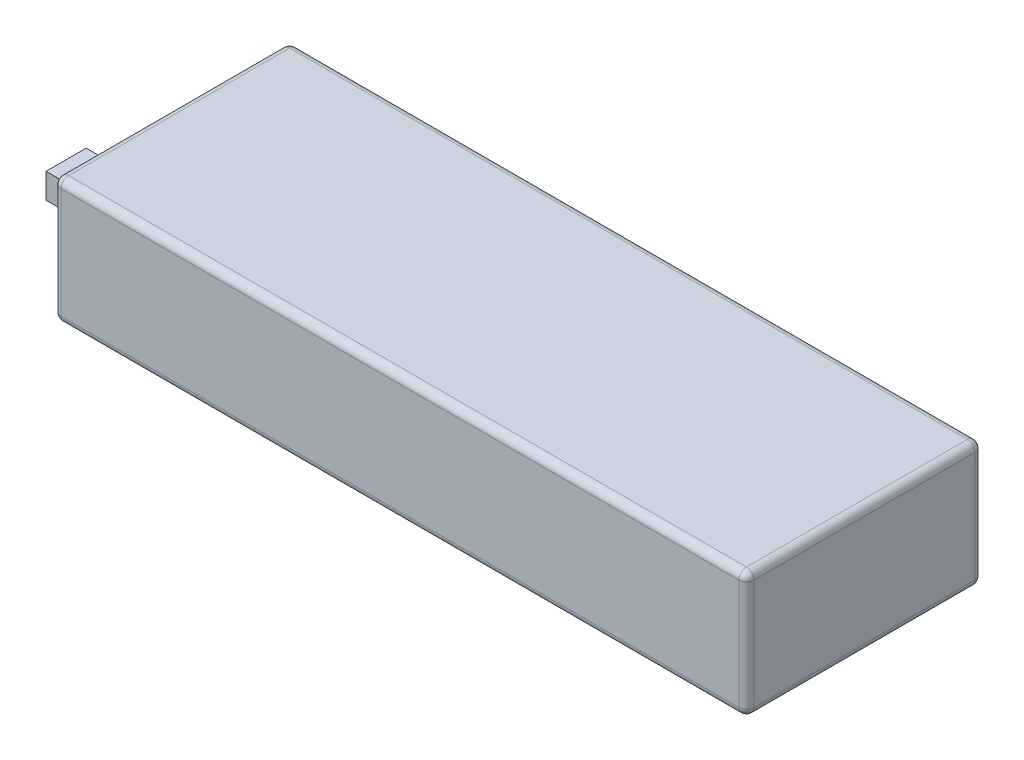
ISO-10303-21;
HEADER;
FILE_DESCRIPTION(('STEP AP214'),'2;1');
FILE_NAME('part.step','',(''),(''),'','','');
FILE_SCHEMA(('AUTOMOTIVE_DESIGN { 1 0 10303 214 1 1 1 1 }'));
ENDSEC;
DATA;
#1=APPLICATION_CONTEXT('core data for automotive mechanical design processes');
#2=APPLICATION_PROTOCOL_DEFINITION('international standard','automotive_design',2000,#1);
#3=PRODUCT_CONTEXT('',#1,'mechanical');
#4=PRODUCT('Part','Part','',(#3));
#5=PRODUCT_RELATED_PRODUCT_CATEGORY('part','',(#4));
#6=PRODUCT_DEFINITION_FORMATION('','',#4);
#7=PRODUCT_DEFINITION_CONTEXT('part definition',#1,'design');
#8=PRODUCT_DEFINITION('design','',#6,#7);
#9=PRODUCT_DEFINITION_SHAPE('','',#8);
#10=(LENGTH_UNIT() NAMED_UNIT(*) SI_UNIT(.MILLI.,.METRE.));
#11=(NAMED_UNIT(*) PLANE_ANGLE_UNIT() SI_UNIT($,.RADIAN.));
#12=(NAMED_UNIT(*) SI_UNIT($,.STERADIAN.) SOLID_ANGLE_UNIT());
#13=UNCERTAINTY_MEASURE_WITH_UNIT(LENGTH_MEASURE(1.E-05),#10,'distance_accuracy_value','');
#14=(GEOMETRIC_REPRESENTATION_CONTEXT(3) GLOBAL_UNCERTAINTY_ASSIGNED_CONTEXT((#13)) GLOBAL_UNIT_ASSIGNED_CONTEXT((#10,
#11,#12)) REPRESENTATION_CONTEXT('',''));
#15=CARTESIAN_POINT('',(0.,0.,0.));
#16=DIRECTION('',(0.,0.,1.));
#17=DIRECTION('',(1.,0.,0.));
#18=AXIS2_PLACEMENT_3D('',#15,#16,#17);
#19=CARTESIAN_POINT('',(-69.,12.5,23.5));
#20=DIRECTION('',(1.,0.,0.));
#21=DIRECTION('',(0.,0.,-1.));
#22=AXIS2_PLACEMENT_3D('',#19,#20,#21);
#23=PLANE('',#22);
#24=DIRECTION('',(0.,-1.,0.));
#25=VECTOR('',#24,1.);
#26=CARTESIAN_POINT('',(-69.,12.5,-22.));
#27=LINE('',#26,#25);
#28=CARTESIAN_POINT('',(-69.,11.,-22.));
#29=VERTEX_POINT('',#28);
#30=CARTESIAN_POINT('',(-69.,-11.,-22.));
#31=VERTEX_POINT('',#30);
#32=EDGE_CURVE('E201',#29,#31,#27,.T.);
#33=ORIENTED_EDGE('',*,*,#32,.T.);
#34=DIRECTION('',(0.,0.,1.));
#35=VECTOR('',#34,1.);
#36=CARTESIAN_POINT('',(-69.,-11.,23.5));
#37=LINE('',#36,#35);
#38=CARTESIAN_POINT('',(-69.,-11.,22.));
#39=VERTEX_POINT('',#38);
#40=EDGE_CURVE('E204',#31,#39,#37,.T.);
#41=ORIENTED_EDGE('',*,*,#40,.T.);
#42=DIRECTION('',(0.,-1.,0.));
#43=VECTOR('',#42,1.);
#44=CARTESIAN_POINT('',(-69.,12.5,22.));
#45=LINE('',#44,#43);
#46=CARTESIAN_POINT('',(-69.,11.,22.));
#47=VERTEX_POINT('',#46);
#48=EDGE_CURVE('E198',#39,#47,#45,.F.);
#49=ORIENTED_EDGE('',*,*,#48,.T.);
#50=DIRECTION('',(0.,0.,1.));
#51=VECTOR('',#50,1.);
#52=CARTESIAN_POINT('',(-69.,11.,23.5));
#53=LINE('',#52,#51);
#54=EDGE_CURVE('E195',#47,#29,#53,.F.);
#55=ORIENTED_EDGE('',*,*,#54,.T.);
#56=EDGE_LOOP('',(#33,#41,#49,#55));
#57=FACE_BOUND('',#56,.T.);
#58=DIRECTION('',(0.,-1.,0.));
#59=VECTOR('',#58,1.);
#60=CARTESIAN_POINT('',(-69.,4.,12.));
#61=LINE('',#60,#59);
#62=CARTESIAN_POINT('',(-69.,9.,12.));
#63=VERTEX_POINT('',#62);
#64=CARTESIAN_POINT('',(-69.,4.,12.));
#65=VERTEX_POINT('',#64);
#66=EDGE_CURVE('E183',#63,#65,#61,.T.);
#67=ORIENTED_EDGE('',*,*,#66,.F.);
#68=DIRECTION('',(0.,0.,-1.));
#69=VECTOR('',#68,1.);
#70=CARTESIAN_POINT('',(-69.,9.,20.));
#71=LINE('',#70,#69);
#72=CARTESIAN_POINT('',(-69.,9.,20.));
#73=VERTEX_POINT('',#72);
#74=EDGE_CURVE('E180',#73,#63,#71,.T.);
#75=ORIENTED_EDGE('',*,*,#74,.F.);
#76=DIRECTION('',(0.,1.,0.));
#77=VECTOR('',#76,1.);
#78=CARTESIAN_POINT('',(-69.,4.,20.));
#79=LINE('',#78,#77);
#80=CARTESIAN_POINT('',(-69.,4.,20.));
#81=VERTEX_POINT('',#80);
#82=EDGE_CURVE('E68',#81,#73,#79,.T.);
#83=ORIENTED_EDGE('',*,*,#82,.F.);
#84=DIRECTION('',(0.,0.,1.));
#85=VECTOR('',#84,1.);
#86=CARTESIAN_POINT('',(-69.,4.,20.));
#87=LINE('',#86,#85);
#88=EDGE_CURVE('E63',#65,#81,#87,.T.);
#89=ORIENTED_EDGE('',*,*,#88,.F.);
#90=EDGE_LOOP('',(#67,#75,#83,#89));
#91=FACE_BOUND('',#90,.T.);
#92=ADVANCED_FACE('F45',(#57,#91),#23,.F.);
#93=CARTESIAN_POINT('',(69.,12.5,23.5));
#94=DIRECTION('',(-1.,0.,0.));
#95=DIRECTION('',(0.,0.,1.));
#96=AXIS2_PLACEMENT_3D('',#93,#94,#95);
#97=PLANE('',#96);
#98=DIRECTION('',(0.,0.,-1.));
#99=VECTOR('',#98,1.);
#100=CARTESIAN_POINT('',(69.,-11.,-23.5));
#101=LINE('',#100,#99);
#102=CARTESIAN_POINT('',(69.,-11.,22.));
#103=VERTEX_POINT('',#102);
#104=CARTESIAN_POINT('',(69.,-11.,-22.));
#105=VERTEX_POINT('',#104);
#106=EDGE_CURVE('E240',#103,#105,#101,.T.);
#107=ORIENTED_EDGE('',*,*,#106,.T.);
#108=DIRECTION('',(0.,-1.,0.));
#109=VECTOR('',#108,1.);
#110=CARTESIAN_POINT('',(69.,12.5,-22.));
#111=LINE('',#110,#109);
#112=CARTESIAN_POINT('',(69.,11.,-22.));
#113=VERTEX_POINT('',#112);
#114=EDGE_CURVE('E243',#105,#113,#111,.F.);
#115=ORIENTED_EDGE('',*,*,#114,.T.);
#116=DIRECTION('',(0.,0.,-1.));
#117=VECTOR('',#116,1.);
#118=CARTESIAN_POINT('',(69.,11.,23.5));
#119=LINE('',#118,#117);
#120=CARTESIAN_POINT('',(69.,11.,22.));
#121=VERTEX_POINT('',#120);
#122=EDGE_CURVE('E234',#113,#121,#119,.F.);
#123=ORIENTED_EDGE('',*,*,#122,.T.);
#124=DIRECTION('',(0.,-1.,0.));
#125=VECTOR('',#124,1.);
#126=CARTESIAN_POINT('',(69.,12.5,22.));
#127=LINE('',#126,#125);
#128=EDGE_CURVE('E237',#121,#103,#127,.T.);
#129=ORIENTED_EDGE('',*,*,#128,.T.);
#130=EDGE_LOOP('',(#107,#115,#123,#129));
#131=FACE_BOUND('',#130,.T.);
#132=ADVANCED_FACE('F366',(#131),#97,.F.);
#133=CARTESIAN_POINT('',(-69.,12.5,-23.5));
#134=DIRECTION('',(0.,0.,1.));
#135=DIRECTION('',(1.,0.,0.));
#136=AXIS2_PLACEMENT_3D('',#133,#134,#135);
#137=PLANE('',#136);
#138=DIRECTION('',(-1.,0.,0.));
#139=VECTOR('',#138,1.);
#140=CARTESIAN_POINT('',(-69.,-11.,-23.5));
#141=LINE('',#140,#139);
#142=CARTESIAN_POINT('',(67.5,-11.,-23.5));
#143=VERTEX_POINT('',#142);
#144=CARTESIAN_POINT('',(-67.5,-11.,-23.5));
#145=VERTEX_POINT('',#144);
#146=EDGE_CURVE('E227',#143,#145,#141,.T.);
#147=ORIENTED_EDGE('',*,*,#146,.T.);
#148=DIRECTION('',(0.,-1.,0.));
#149=VECTOR('',#148,1.);
#150=CARTESIAN_POINT('',(-67.5,12.5,-23.5));
#151=LINE('',#150,#149);
#152=CARTESIAN_POINT('',(-67.5,11.,-23.5));
#153=VERTEX_POINT('',#152);
#154=EDGE_CURVE('E230',#145,#153,#151,.F.);
#155=ORIENTED_EDGE('',*,*,#154,.T.);
#156=DIRECTION('',(-1.,0.,0.));
#157=VECTOR('',#156,1.);
#158=CARTESIAN_POINT('',(-69.,11.,-23.5));
#159=LINE('',#158,#157);
#160=CARTESIAN_POINT('',(67.5,11.,-23.5));
#161=VERTEX_POINT('',#160);
#162=EDGE_CURVE('E221',#153,#161,#159,.F.);
#163=ORIENTED_EDGE('',*,*,#162,.T.);
#164=DIRECTION('',(0.,-1.,0.));
#165=VECTOR('',#164,1.);
#166=CARTESIAN_POINT('',(67.5,12.5,-23.5));
#167=LINE('',#166,#165);
#168=EDGE_CURVE('E224',#161,#143,#167,.T.);
#169=ORIENTED_EDGE('',*,*,#168,.T.);
#170=EDGE_LOOP('',(#147,#155,#163,#169));
#171=FACE_BOUND('',#170,.T.);
#172=ADVANCED_FACE('F387',(#171),#137,.F.);
#173=CARTESIAN_POINT('',(-69.,12.5,23.5));
#174=DIRECTION('',(0.,0.,-1.));
#175=DIRECTION('',(-1.,0.,0.));
#176=AXIS2_PLACEMENT_3D('',#173,#174,#175);
#177=PLANE('',#176);
#178=DIRECTION('',(0.,-1.,0.));
#179=VECTOR('',#178,1.);
#180=CARTESIAN_POINT('',(-67.5,12.5,23.5));
#181=LINE('',#180,#179);
#182=CARTESIAN_POINT('',(-67.5,11.,23.5));
#183=VERTEX_POINT('',#182);
#184=CARTESIAN_POINT('',(-67.5,-11.,23.5));
#185=VERTEX_POINT('',#184);
#186=EDGE_CURVE('E253',#183,#185,#181,.T.);
#187=ORIENTED_EDGE('',*,*,#186,.T.);
#188=DIRECTION('',(1.,0.,0.));
#189=VECTOR('',#188,1.);
#190=CARTESIAN_POINT('',(69.,-11.,23.5));
#191=LINE('',#190,#189);
#192=CARTESIAN_POINT('',(67.5,-11.,23.5));
#193=VERTEX_POINT('',#192);
#194=EDGE_CURVE('E257',#185,#193,#191,.T.);
#195=ORIENTED_EDGE('',*,*,#194,.T.);
#196=DIRECTION('',(0.,-1.,0.));
#197=VECTOR('',#196,1.);
#198=CARTESIAN_POINT('',(67.5,12.5,23.5));
#199=LINE('',#198,#197);
#200=CARTESIAN_POINT('',(67.5,11.,23.5));
#201=VERTEX_POINT('',#200);
#202=EDGE_CURVE('E250',#193,#201,#199,.F.);
#203=ORIENTED_EDGE('',*,*,#202,.T.);
#204=DIRECTION('',(1.,0.,0.));
#205=VECTOR('',#204,1.);
#206=CARTESIAN_POINT('',(-69.,11.,23.5));
#207=LINE('',#206,#205);
#208=EDGE_CURVE('E247',#201,#183,#207,.F.);
#209=ORIENTED_EDGE('',*,*,#208,.T.);
#210=EDGE_LOOP('',(#187,#195,#203,#209));
#211=FACE_BOUND('',#210,.T.);
#212=ADVANCED_FACE('F483',(#211),#177,.F.);
#213=CARTESIAN_POINT('',(0.,12.5,0.));
#214=DIRECTION('',(0.,-1.,0.));
#215=DIRECTION('',(0.,0.,-1.));
#216=AXIS2_PLACEMENT_3D('',#213,#214,#215);
#217=PLANE('',#216);
#218=DIRECTION('',(0.,0.,1.));
#219=VECTOR('',#218,1.);
#220=CARTESIAN_POINT('',(-67.5,12.5,0.));
#221=LINE('',#220,#219);
#222=CARTESIAN_POINT('',(-67.5,12.5,-22.));
#223=VERTEX_POINT('',#222);
#224=CARTESIAN_POINT('',(-67.5,12.5,22.));
#225=VERTEX_POINT('',#224);
#226=EDGE_CURVE('E55',#223,#225,#221,.T.);
#227=ORIENTED_EDGE('',*,*,#226,.T.);
#228=DIRECTION('',(1.,0.,0.));
#229=VECTOR('',#228,1.);
#230=CARTESIAN_POINT('',(0.,12.5,22.));
#231=LINE('',#230,#229);
#232=CARTESIAN_POINT('',(67.5,12.5,22.));
#233=VERTEX_POINT('',#232);
#234=EDGE_CURVE('E11',#225,#233,#231,.T.);
#235=ORIENTED_EDGE('',*,*,#234,.T.);
#236=DIRECTION('',(0.,0.,-1.));
#237=VECTOR('',#236,1.);
#238=CARTESIAN_POINT('',(67.5,12.5,0.));
#239=LINE('',#238,#237);
#240=CARTESIAN_POINT('',(67.5,12.5,-22.));
#241=VERTEX_POINT('',#240);
#242=EDGE_CURVE('E260',#233,#241,#239,.T.);
#243=ORIENTED_EDGE('',*,*,#242,.T.);
#244=DIRECTION('',(-1.,0.,0.));
#245=VECTOR('',#244,1.);
#246=CARTESIAN_POINT('',(0.,12.5,-22.));
#247=LINE('',#246,#245);
#248=EDGE_CURVE('E263',#241,#223,#247,.T.);
#249=ORIENTED_EDGE('',*,*,#248,.T.);
#250=EDGE_LOOP('',(#227,#235,#243,#249));
#251=FACE_BOUND('',#250,.T.);
#252=ADVANCED_FACE('F403',(#251),#217,.F.);
#253=CARTESIAN_POINT('',(0.,-12.5,0.));
#254=DIRECTION('',(0.,-1.,0.));
#255=DIRECTION('',(0.,0.,-1.));
#256=AXIS2_PLACEMENT_3D('',#253,#254,#255);
#257=PLANE('',#256);
#258=DIRECTION('',(1.,0.,0.));
#259=VECTOR('',#258,1.);
#260=CARTESIAN_POINT('',(-69.,-12.5,22.));
#261=LINE('',#260,#259);
#262=CARTESIAN_POINT('',(67.5,-12.5,22.));
#263=VERTEX_POINT('',#262);
#264=CARTESIAN_POINT('',(-67.5,-12.5,22.));
#265=VERTEX_POINT('',#264);
#266=EDGE_CURVE('E208',#263,#265,#261,.F.);
#267=ORIENTED_EDGE('',*,*,#266,.T.);
#268=DIRECTION('',(0.,0.,1.));
#269=VECTOR('',#268,1.);
#270=CARTESIAN_POINT('',(-67.5,-12.5,-23.5));
#271=LINE('',#270,#269);
#272=CARTESIAN_POINT('',(-67.5,-12.5,-22.));
#273=VERTEX_POINT('',#272);
#274=EDGE_CURVE('E217',#265,#273,#271,.F.);
#275=ORIENTED_EDGE('',*,*,#274,.T.);
#276=DIRECTION('',(-1.,0.,0.));
#277=VECTOR('',#276,1.);
#278=CARTESIAN_POINT('',(69.,-12.5,-22.));
#279=LINE('',#278,#277);
#280=CARTESIAN_POINT('',(67.5,-12.5,-22.));
#281=VERTEX_POINT('',#280);
#282=EDGE_CURVE('E214',#273,#281,#279,.F.);
#283=ORIENTED_EDGE('',*,*,#282,.T.);
#284=DIRECTION('',(0.,0.,-1.));
#285=VECTOR('',#284,1.);
#286=CARTESIAN_POINT('',(67.5,-12.5,23.5));
#287=LINE('',#286,#285);
#288=EDGE_CURVE('E211',#281,#263,#287,.F.);
#289=ORIENTED_EDGE('',*,*,#288,.T.);
#290=EDGE_LOOP('',(#267,#275,#283,#289));
#291=FACE_BOUND('',#290,.T.);
#292=ADVANCED_FACE('F432',(#291),#257,.T.);
#293=CARTESIAN_POINT('',(67.5,11.,0.));
#294=DIRECTION('',(0.,0.,-1.));
#295=DIRECTION('',(-1.,0.,0.));
#296=AXIS2_PLACEMENT_3D('',#293,#294,#295);
#297=CYLINDRICAL_SURFACE('',#296,1.5);
#298=CARTESIAN_POINT('',(67.5,11.,-22.));
#299=DIRECTION('',(0.,0.,-1.));
#300=DIRECTION('',(-1.,0.,0.));
#301=AXIS2_PLACEMENT_3D('',#298,#299,#300);
#302=CIRCLE('',#301,1.5);
#303=EDGE_CURVE('E49',#241,#113,#302,.T.);
#304=ORIENTED_EDGE('',*,*,#303,.F.);
#305=ORIENTED_EDGE('',*,*,#242,.F.);
#306=CARTESIAN_POINT('',(67.5,11.,22.));
#307=DIRECTION('',(0.,0.,1.));
#308=DIRECTION('',(1.,0.,0.));
#309=AXIS2_PLACEMENT_3D('',#306,#307,#308);
#310=CIRCLE('',#309,1.5);
#311=EDGE_CURVE('E345',#121,#233,#310,.T.);
#312=ORIENTED_EDGE('',*,*,#311,.F.);
#313=ORIENTED_EDGE('',*,*,#122,.F.);
#314=EDGE_LOOP('',(#304,#305,#312,#313));
#315=FACE_BOUND('',#314,.T.);
#316=ADVANCED_FACE('F47',(#315),#297,.T.);
#317=CARTESIAN_POINT('',(67.5,11.,-22.));
#318=DIRECTION('',(1.,0.,0.));
#319=DIRECTION('',(0.,0.,-1.));
#320=AXIS2_PLACEMENT_3D('',#317,#318,#319);
#321=SPHERICAL_SURFACE('',#320,1.5);
#322=CARTESIAN_POINT('',(67.5,11.,-22.));
#323=DIRECTION('',(1.,0.,0.));
#324=DIRECTION('',(0.,0.,-1.));
#325=AXIS2_PLACEMENT_3D('',#322,#323,#324);
#326=CIRCLE('',#325,1.5);
#327=EDGE_CURVE('E339',#241,#161,#326,.F.);
#328=ORIENTED_EDGE('',*,*,#327,.F.);
#329=ORIENTED_EDGE('',*,*,#303,.T.);
#330=CARTESIAN_POINT('',(67.5,11.,-22.));
#331=DIRECTION('',(0.,1.,0.));
#332=DIRECTION('',(0.,0.,1.));
#333=AXIS2_PLACEMENT_3D('',#330,#331,#332);
#334=CIRCLE('',#333,1.5);
#335=EDGE_CURVE('E343',#161,#113,#334,.F.);
#336=ORIENTED_EDGE('',*,*,#335,.F.);
#337=EDGE_LOOP('',(#328,#329,#336));
#338=FACE_BOUND('',#337,.T.);
#339=ADVANCED_FACE('F360',(#338),#321,.T.);
#340=CARTESIAN_POINT('',(67.5,11.,22.));
#341=DIRECTION('',(0.,1.,0.));
#342=DIRECTION('',(0.,0.,1.));
#343=AXIS2_PLACEMENT_3D('',#340,#341,#342);
#344=SPHERICAL_SURFACE('',#343,1.5);
#345=CARTESIAN_POINT('',(67.5,11.,22.));
#346=DIRECTION('',(0.,1.,0.));
#347=DIRECTION('',(0.,0.,1.));
#348=AXIS2_PLACEMENT_3D('',#345,#346,#347);
#349=CIRCLE('',#348,1.5);
#350=EDGE_CURVE('E332',#121,#201,#349,.F.);
#351=ORIENTED_EDGE('',*,*,#350,.F.);
#352=ORIENTED_EDGE('',*,*,#311,.T.);
#353=CARTESIAN_POINT('',(67.5,11.,22.));
#354=DIRECTION('',(1.,0.,0.));
#355=DIRECTION('',(0.,0.,-1.));
#356=AXIS2_PLACEMENT_3D('',#353,#354,#355);
#357=CIRCLE('',#356,1.5);
#358=EDGE_CURVE('E336',#201,#233,#357,.F.);
#359=ORIENTED_EDGE('',*,*,#358,.F.);
#360=EDGE_LOOP('',(#351,#352,#359));
#361=FACE_BOUND('',#360,.T.);
#362=ADVANCED_FACE('F417',(#361),#344,.T.);
#363=CARTESIAN_POINT('',(67.5,12.5,-22.));
#364=DIRECTION('',(0.,-1.,0.));
#365=DIRECTION('',(0.,0.,-1.));
#366=AXIS2_PLACEMENT_3D('',#363,#364,#365);
#367=CYLINDRICAL_SURFACE('',#366,1.5);
#368=ORIENTED_EDGE('',*,*,#335,.T.);
#369=ORIENTED_EDGE('',*,*,#114,.F.);
#370=CARTESIAN_POINT('',(67.5,-11.,-22.));
#371=DIRECTION('',(0.,-1.,0.));
#372=DIRECTION('',(0.,0.,-1.));
#373=AXIS2_PLACEMENT_3D('',#370,#371,#372);
#374=CIRCLE('',#373,1.5);
#375=EDGE_CURVE('E324',#143,#105,#374,.T.);
#376=ORIENTED_EDGE('',*,*,#375,.F.);
#377=ORIENTED_EDGE('',*,*,#168,.F.);
#378=EDGE_LOOP('',(#368,#369,#376,#377));
#379=FACE_BOUND('',#378,.T.);
#380=ADVANCED_FACE('F371',(#379),#367,.T.);
#381=CARTESIAN_POINT('',(0.,11.,-22.));
#382=DIRECTION('',(-1.,0.,0.));
#383=DIRECTION('',(0.,0.,1.));
#384=AXIS2_PLACEMENT_3D('',#381,#382,#383);
#385=CYLINDRICAL_SURFACE('',#384,1.5);
#386=ORIENTED_EDGE('',*,*,#327,.T.);
#387=ORIENTED_EDGE('',*,*,#162,.F.);
#388=CARTESIAN_POINT('',(-67.5,11.,-22.));
#389=DIRECTION('',(-1.,0.,0.));
#390=DIRECTION('',(0.,0.,1.));
#391=AXIS2_PLACEMENT_3D('',#388,#389,#390);
#392=CIRCLE('',#391,1.5);
#393=EDGE_CURVE('E320',#223,#153,#392,.T.);
#394=ORIENTED_EDGE('',*,*,#393,.F.);
#395=ORIENTED_EDGE('',*,*,#248,.F.);
#396=EDGE_LOOP('',(#386,#387,#394,#395));
#397=FACE_BOUND('',#396,.T.);
#398=ADVANCED_FACE('F400',(#397),#385,.T.);
#399=CARTESIAN_POINT('',(-67.5,11.,0.));
#400=DIRECTION('',(0.,0.,1.));
#401=DIRECTION('',(1.,0.,0.));
#402=AXIS2_PLACEMENT_3D('',#399,#400,#401);
#403=CYLINDRICAL_SURFACE('',#402,1.5);
#404=CARTESIAN_POINT('',(-67.5,11.,22.));
#405=DIRECTION('',(0.,0.,1.));
#406=DIRECTION('',(1.,0.,0.));
#407=AXIS2_PLACEMENT_3D('',#404,#405,#406);
#408=CIRCLE('',#407,1.5);
#409=EDGE_CURVE('E312',#225,#47,#408,.T.);
#410=ORIENTED_EDGE('',*,*,#409,.F.);
#411=ORIENTED_EDGE('',*,*,#226,.F.);
#412=CARTESIAN_POINT('',(-67.5,11.,-22.));
#413=DIRECTION('',(0.,0.,-1.));
#414=DIRECTION('',(-1.,0.,0.));
#415=AXIS2_PLACEMENT_3D('',#412,#413,#414);
#416=CIRCLE('',#415,1.5);
#417=EDGE_CURVE('E316',#29,#223,#416,.T.);
#418=ORIENTED_EDGE('',*,*,#417,.F.);
#419=ORIENTED_EDGE('',*,*,#54,.F.);
#420=EDGE_LOOP('',(#410,#411,#418,#419));
#421=FACE_BOUND('',#420,.T.);
#422=ADVANCED_FACE('F407',(#421),#403,.T.);
#423=CARTESIAN_POINT('',(0.,11.,22.));
#424=DIRECTION('',(1.,0.,0.));
#425=DIRECTION('',(0.,0.,-1.));
#426=AXIS2_PLACEMENT_3D('',#423,#424,#425);
#427=CYLINDRICAL_SURFACE('',#426,1.5);
#428=ORIENTED_EDGE('',*,*,#358,.T.);
#429=ORIENTED_EDGE('',*,*,#234,.F.);
#430=CARTESIAN_POINT('',(-67.5,11.,22.));
#431=DIRECTION('',(-1.,0.,0.));
#432=DIRECTION('',(0.,0.,1.));
#433=AXIS2_PLACEMENT_3D('',#430,#431,#432);
#434=CIRCLE('',#433,1.5);
#435=EDGE_CURVE('E308',#183,#225,#434,.T.);
#436=ORIENTED_EDGE('',*,*,#435,.F.);
#437=ORIENTED_EDGE('',*,*,#208,.F.);
#438=EDGE_LOOP('',(#428,#429,#436,#437));
#439=FACE_BOUND('',#438,.T.);
#440=ADVANCED_FACE('F416',(#439),#427,.T.);
#441=CARTESIAN_POINT('',(67.5,12.5,22.));
#442=DIRECTION('',(0.,-1.,0.));
#443=DIRECTION('',(0.,0.,-1.));
#444=AXIS2_PLACEMENT_3D('',#441,#442,#443);
#445=CYLINDRICAL_SURFACE('',#444,1.5);
#446=ORIENTED_EDGE('',*,*,#350,.T.);
#447=ORIENTED_EDGE('',*,*,#202,.F.);
#448=CARTESIAN_POINT('',(67.5,-11.,22.));
#449=DIRECTION('',(0.,-1.,0.));
#450=DIRECTION('',(0.,0.,-1.));
#451=AXIS2_PLACEMENT_3D('',#448,#449,#450);
#452=CIRCLE('',#451,1.5);
#453=EDGE_CURVE('E304',#103,#193,#452,.T.);
#454=ORIENTED_EDGE('',*,*,#453,.F.);
#455=ORIENTED_EDGE('',*,*,#128,.F.);
#456=EDGE_LOOP('',(#446,#447,#454,#455));
#457=FACE_BOUND('',#456,.T.);
#458=ADVANCED_FACE('F421',(#457),#445,.T.);
#459=CARTESIAN_POINT('',(67.5,-11.,23.5));
#460=DIRECTION('',(0.,0.,1.));
#461=DIRECTION('',(1.,0.,0.));
#462=AXIS2_PLACEMENT_3D('',#459,#460,#461);
#463=CYLINDRICAL_SURFACE('',#462,1.5);
#464=CARTESIAN_POINT('',(67.5,-11.,-22.));
#465=DIRECTION('',(0.,0.,-1.));
#466=DIRECTION('',(-1.,0.,0.));
#467=AXIS2_PLACEMENT_3D('',#464,#465,#466);
#468=CIRCLE('',#467,1.5);
#469=EDGE_CURVE('E328',#105,#281,#468,.T.);
#470=ORIENTED_EDGE('',*,*,#469,.F.);
#471=ORIENTED_EDGE('',*,*,#106,.F.);
#472=CARTESIAN_POINT('',(67.5,-11.,22.));
#473=DIRECTION('',(0.,0.,1.));
#474=DIRECTION('',(1.,0.,0.));
#475=AXIS2_PLACEMENT_3D('',#472,#473,#474);
#476=CIRCLE('',#475,1.5);
#477=EDGE_CURVE('E300',#263,#103,#476,.T.);
#478=ORIENTED_EDGE('',*,*,#477,.F.);
#479=ORIENTED_EDGE('',*,*,#288,.F.);
#480=EDGE_LOOP('',(#470,#471,#478,#479));
#481=FACE_BOUND('',#480,.T.);
#482=ADVANCED_FACE('F375',(#481),#463,.T.);
#483=CARTESIAN_POINT('',(67.5,-11.,-22.));
#484=DIRECTION('',(1.,0.,0.));
#485=DIRECTION('',(0.,1.,0.));
#486=AXIS2_PLACEMENT_3D('',#483,#484,#485);
#487=SPHERICAL_SURFACE('',#486,1.5);
#488=ORIENTED_EDGE('',*,*,#375,.T.);
#489=ORIENTED_EDGE('',*,*,#469,.T.);
#490=CARTESIAN_POINT('',(67.5,-11.,-22.));
#491=DIRECTION('',(1.,0.,0.));
#492=DIRECTION('',(0.,0.,-1.));
#493=AXIS2_PLACEMENT_3D('',#490,#491,#492);
#494=CIRCLE('',#493,1.5);
#495=EDGE_CURVE('E296',#143,#281,#494,.F.);
#496=ORIENTED_EDGE('',*,*,#495,.F.);
#497=EDGE_LOOP('',(#488,#489,#496));
#498=FACE_BOUND('',#497,.T.);
#499=ADVANCED_FACE('F379',(#498),#487,.T.);
#500=CARTESIAN_POINT('',(-67.5,11.,-22.));
#501=DIRECTION('',(0.,1.,0.));
#502=DIRECTION('',(0.,0.,1.));
#503=AXIS2_PLACEMENT_3D('',#500,#501,#502);
#504=SPHERICAL_SURFACE('',#503,1.5);
#505=ORIENTED_EDGE('',*,*,#417,.T.);
#506=ORIENTED_EDGE('',*,*,#393,.T.);
#507=CARTESIAN_POINT('',(-67.5,11.,-22.));
#508=DIRECTION('',(0.,1.,0.));
#509=DIRECTION('',(0.,0.,1.));
#510=AXIS2_PLACEMENT_3D('',#507,#508,#509);
#511=CIRCLE('',#510,1.5);
#512=EDGE_CURVE('E293',#29,#153,#511,.F.);
#513=ORIENTED_EDGE('',*,*,#512,.F.);
#514=EDGE_LOOP('',(#505,#506,#513));
#515=FACE_BOUND('',#514,.T.);
#516=ADVANCED_FACE('F397',(#515),#504,.T.);
#517=CARTESIAN_POINT('',(-67.5,11.,22.));
#518=DIRECTION('',(0.,1.,0.));
#519=DIRECTION('',(0.,0.,1.));
#520=AXIS2_PLACEMENT_3D('',#517,#518,#519);
#521=SPHERICAL_SURFACE('',#520,1.5);
#522=ORIENTED_EDGE('',*,*,#435,.T.);
#523=ORIENTED_EDGE('',*,*,#409,.T.);
#524=CARTESIAN_POINT('',(-67.5,11.,22.));
#525=DIRECTION('',(0.,1.,0.));
#526=DIRECTION('',(0.,0.,1.));
#527=AXIS2_PLACEMENT_3D('',#524,#525,#526);
#528=CIRCLE('',#527,1.5);
#529=EDGE_CURVE('E289',#183,#47,#528,.F.);
#530=ORIENTED_EDGE('',*,*,#529,.F.);
#531=EDGE_LOOP('',(#522,#523,#530));
#532=FACE_BOUND('',#531,.T.);
#533=ADVANCED_FACE('F412',(#532),#521,.T.);
#534=CARTESIAN_POINT('',(67.5,-11.,22.));
#535=DIRECTION('',(1.,0.,0.));
#536=DIRECTION('',(0.,1.,0.));
#537=AXIS2_PLACEMENT_3D('',#534,#535,#536);
#538=SPHERICAL_SURFACE('',#537,1.5);
#539=ORIENTED_EDGE('',*,*,#477,.T.);
#540=ORIENTED_EDGE('',*,*,#453,.T.);
#541=CARTESIAN_POINT('',(67.5,-11.,22.));
#542=DIRECTION('',(1.,0.,0.));
#543=DIRECTION('',(0.,0.,-1.));
#544=AXIS2_PLACEMENT_3D('',#541,#542,#543);
#545=CIRCLE('',#544,1.5);
#546=EDGE_CURVE('E285',#263,#193,#545,.F.);
#547=ORIENTED_EDGE('',*,*,#546,.F.);
#548=EDGE_LOOP('',(#539,#540,#547));
#549=FACE_BOUND('',#548,.T.);
#550=ADVANCED_FACE('F424',(#549),#538,.T.);
#551=CARTESIAN_POINT('',(-69.,-11.,-22.));
#552=DIRECTION('',(1.,0.,0.));
#553=DIRECTION('',(0.,0.,-1.));
#554=AXIS2_PLACEMENT_3D('',#551,#552,#553);
#555=CYLINDRICAL_SURFACE('',#554,1.5);
#556=ORIENTED_EDGE('',*,*,#495,.T.);
#557=ORIENTED_EDGE('',*,*,#282,.F.);
#558=CARTESIAN_POINT('',(-67.5,-11.,-22.));
#559=DIRECTION('',(-1.,0.,0.));
#560=DIRECTION('',(0.,0.,1.));
#561=AXIS2_PLACEMENT_3D('',#558,#559,#560);
#562=CIRCLE('',#561,1.5);
#563=EDGE_CURVE('E281',#145,#273,#562,.T.);
#564=ORIENTED_EDGE('',*,*,#563,.F.);
#565=ORIENTED_EDGE('',*,*,#146,.F.);
#566=EDGE_LOOP('',(#556,#557,#564,#565));
#567=FACE_BOUND('',#566,.T.);
#568=ADVANCED_FACE('F384',(#567),#555,.T.);
#569=CARTESIAN_POINT('',(-67.5,12.5,-22.));
#570=DIRECTION('',(0.,-1.,0.));
#571=DIRECTION('',(0.,0.,-1.));
#572=AXIS2_PLACEMENT_3D('',#569,#570,#571);
#573=CYLINDRICAL_SURFACE('',#572,1.5);
#574=ORIENTED_EDGE('',*,*,#512,.T.);
#575=ORIENTED_EDGE('',*,*,#154,.F.);
#576=CARTESIAN_POINT('',(-67.5,-11.,-22.));
#577=DIRECTION('',(0.,-1.,0.));
#578=DIRECTION('',(0.,0.,-1.));
#579=AXIS2_PLACEMENT_3D('',#576,#577,#578);
#580=CIRCLE('',#579,1.5);
#581=EDGE_CURVE('E277',#31,#145,#580,.T.);
#582=ORIENTED_EDGE('',*,*,#581,.F.);
#583=ORIENTED_EDGE('',*,*,#32,.F.);
#584=EDGE_LOOP('',(#574,#575,#582,#583));
#585=FACE_BOUND('',#584,.T.);
#586=ADVANCED_FACE('F390',(#585),#573,.T.);
#587=CARTESIAN_POINT('',(-67.5,12.5,22.));
#588=DIRECTION('',(0.,-1.,0.));
#589=DIRECTION('',(0.,0.,-1.));
#590=AXIS2_PLACEMENT_3D('',#587,#588,#589);
#591=CYLINDRICAL_SURFACE('',#590,1.5);
#592=ORIENTED_EDGE('',*,*,#529,.T.);
#593=ORIENTED_EDGE('',*,*,#48,.F.);
#594=CARTESIAN_POINT('',(-67.5,-11.,22.));
#595=DIRECTION('',(0.,-1.,0.));
#596=DIRECTION('',(0.,0.,-1.));
#597=AXIS2_PLACEMENT_3D('',#594,#595,#596);
#598=CIRCLE('',#597,1.5);
#599=EDGE_CURVE('E273',#185,#39,#598,.T.);
#600=ORIENTED_EDGE('',*,*,#599,.F.);
#601=ORIENTED_EDGE('',*,*,#186,.F.);
#602=EDGE_LOOP('',(#592,#593,#600,#601));
#603=FACE_BOUND('',#602,.T.);
#604=ADVANCED_FACE('F442',(#603),#591,.T.);
#605=CARTESIAN_POINT('',(-69.,-11.,22.));
#606=DIRECTION('',(-1.,0.,0.));
#607=DIRECTION('',(0.,0.,1.));
#608=AXIS2_PLACEMENT_3D('',#605,#606,#607);
#609=CYLINDRICAL_SURFACE('',#608,1.5);
#610=ORIENTED_EDGE('',*,*,#546,.T.);
#611=ORIENTED_EDGE('',*,*,#194,.F.);
#612=CARTESIAN_POINT('',(-67.5,-11.,22.));
#613=DIRECTION('',(-1.,0.,0.));
#614=DIRECTION('',(0.,0.,1.));
#615=AXIS2_PLACEMENT_3D('',#612,#613,#614);
#616=CIRCLE('',#615,1.5);
#617=EDGE_CURVE('E270',#265,#185,#616,.T.);
#618=ORIENTED_EDGE('',*,*,#617,.F.);
#619=ORIENTED_EDGE('',*,*,#266,.F.);
#620=EDGE_LOOP('',(#610,#611,#618,#619));
#621=FACE_BOUND('',#620,.T.);
#622=ADVANCED_FACE('F429',(#621),#609,.T.);
#623=CARTESIAN_POINT('',(-67.5,-11.,-22.));
#624=DIRECTION('',(0.,0.,-1.));
#625=DIRECTION('',(0.,1.,0.));
#626=AXIS2_PLACEMENT_3D('',#623,#624,#625);
#627=SPHERICAL_SURFACE('',#626,1.5);
#628=ORIENTED_EDGE('',*,*,#581,.T.);
#629=ORIENTED_EDGE('',*,*,#563,.T.);
#630=CARTESIAN_POINT('',(-67.5,-11.,-22.));
#631=DIRECTION('',(0.,0.,-1.));
#632=DIRECTION('',(-1.,0.,0.));
#633=AXIS2_PLACEMENT_3D('',#630,#631,#632);
#634=CIRCLE('',#633,1.5);
#635=EDGE_CURVE('E189',#31,#273,#634,.F.);
#636=ORIENTED_EDGE('',*,*,#635,.F.);
#637=EDGE_LOOP('',(#628,#629,#636));
#638=FACE_BOUND('',#637,.T.);
#639=ADVANCED_FACE('F497',(#638),#627,.T.);
#640=CARTESIAN_POINT('',(-67.5,-11.,22.));
#641=DIRECTION('',(0.,0.,1.));
#642=DIRECTION('',(0.,-1.,0.));
#643=AXIS2_PLACEMENT_3D('',#640,#641,#642);
#644=SPHERICAL_SURFACE('',#643,1.5);
#645=ORIENTED_EDGE('',*,*,#617,.T.);
#646=ORIENTED_EDGE('',*,*,#599,.T.);
#647=CARTESIAN_POINT('',(-67.5,-11.,22.));
#648=DIRECTION('',(0.,0.,1.));
#649=DIRECTION('',(1.,0.,0.));
#650=AXIS2_PLACEMENT_3D('',#647,#648,#649);
#651=CIRCLE('',#650,1.5);
#652=EDGE_CURVE('E185',#265,#39,#651,.F.);
#653=ORIENTED_EDGE('',*,*,#652,.F.);
#654=EDGE_LOOP('',(#645,#646,#653));
#655=FACE_BOUND('',#654,.T.);
#656=ADVANCED_FACE('F438',(#655),#644,.T.);
#657=CARTESIAN_POINT('',(-67.5,-11.,23.5));
#658=DIRECTION('',(0.,0.,-1.));
#659=DIRECTION('',(-1.,0.,0.));
#660=AXIS2_PLACEMENT_3D('',#657,#658,#659);
#661=CYLINDRICAL_SURFACE('',#660,1.5);
#662=ORIENTED_EDGE('',*,*,#635,.T.);
#663=ORIENTED_EDGE('',*,*,#274,.F.);
#664=ORIENTED_EDGE('',*,*,#652,.T.);
#665=ORIENTED_EDGE('',*,*,#40,.F.);
#666=EDGE_LOOP('',(#662,#663,#664,#665));
#667=FACE_BOUND('',#666,.T.);
#668=ADVANCED_FACE('F435',(#667),#661,.T.);
#669=CARTESIAN_POINT('',(-74.,4.,12.));
#670=DIRECTION('',(0.,0.,1.));
#671=DIRECTION('',(1.,0.,0.));
#672=AXIS2_PLACEMENT_3D('',#669,#670,#671);
#673=PLANE('',#672);
#674=ORIENTED_EDGE('',*,*,#66,.T.);
#675=DIRECTION('',(1.,0.,0.));
#676=VECTOR('',#675,1.);
#677=CARTESIAN_POINT('',(-74.,4.,12.));
#678=LINE('',#677,#676);
#679=CARTESIAN_POINT('',(-74.,4.,12.));
#680=VERTEX_POINT('',#679);
#681=EDGE_CURVE('E162',#680,#65,#678,.T.);
#682=ORIENTED_EDGE('',*,*,#681,.F.);
#683=DIRECTION('',(0.,-1.,0.));
#684=VECTOR('',#683,1.);
#685=CARTESIAN_POINT('',(-74.,4.,12.));
#686=LINE('',#685,#684);
#687=CARTESIAN_POINT('',(-74.,9.,12.));
#688=VERTEX_POINT('',#687);
#689=EDGE_CURVE('E170',#688,#680,#686,.T.);
#690=ORIENTED_EDGE('',*,*,#689,.F.);
#691=DIRECTION('',(1.,0.,0.));
#692=VECTOR('',#691,1.);
#693=CARTESIAN_POINT('',(-74.,9.,12.));
#694=LINE('',#693,#692);
#695=EDGE_CURVE('E452',#688,#63,#694,.T.);
#696=ORIENTED_EDGE('',*,*,#695,.T.);
#697=EDGE_LOOP('',(#674,#682,#690,#696));
#698=FACE_BOUND('',#697,.T.);
#699=ADVANCED_FACE('F182',(#698),#673,.F.);
#700=CARTESIAN_POINT('',(-74.,4.,20.));
#701=DIRECTION('',(0.,1.,0.));
#702=DIRECTION('',(0.,0.,1.));
#703=AXIS2_PLACEMENT_3D('',#700,#701,#702);
#704=PLANE('',#703);
#705=ORIENTED_EDGE('',*,*,#88,.T.);
#706=DIRECTION('',(1.,0.,0.));
#707=VECTOR('',#706,1.);
#708=CARTESIAN_POINT('',(-74.,4.,20.));
#709=LINE('',#708,#707);
#710=CARTESIAN_POINT('',(-74.,4.,20.));
#711=VERTEX_POINT('',#710);
#712=EDGE_CURVE('E165',#711,#81,#709,.T.);
#713=ORIENTED_EDGE('',*,*,#712,.F.);
#714=DIRECTION('',(0.,0.,1.));
#715=VECTOR('',#714,1.);
#716=CARTESIAN_POINT('',(-74.,4.,20.));
#717=LINE('',#716,#715);
#718=EDGE_CURVE('E158',#680,#711,#717,.T.);
#719=ORIENTED_EDGE('',*,*,#718,.F.);
#720=ORIENTED_EDGE('',*,*,#681,.T.);
#721=EDGE_LOOP('',(#705,#713,#719,#720));
#722=FACE_BOUND('',#721,.T.);
#723=ADVANCED_FACE('F160',(#722),#704,.F.);
#724=CARTESIAN_POINT('',(-74.,4.,20.));
#725=DIRECTION('',(0.,0.,-1.));
#726=DIRECTION('',(-1.,0.,0.));
#727=AXIS2_PLACEMENT_3D('',#724,#725,#726);
#728=PLANE('',#727);
#729=ORIENTED_EDGE('',*,*,#82,.T.);
#730=DIRECTION('',(1.,0.,0.));
#731=VECTOR('',#730,1.);
#732=CARTESIAN_POINT('',(-74.,9.,20.));
#733=LINE('',#732,#731);
#734=CARTESIAN_POINT('',(-74.,9.,20.));
#735=VERTEX_POINT('',#734);
#736=EDGE_CURVE('E191',#735,#73,#733,.T.);
#737=ORIENTED_EDGE('',*,*,#736,.F.);
#738=DIRECTION('',(0.,1.,0.));
#739=VECTOR('',#738,1.);
#740=CARTESIAN_POINT('',(-74.,4.,20.));
#741=LINE('',#740,#739);
#742=EDGE_CURVE('E169',#711,#735,#741,.T.);
#743=ORIENTED_EDGE('',*,*,#742,.F.);
#744=ORIENTED_EDGE('',*,*,#712,.T.);
#745=EDGE_LOOP('',(#729,#737,#743,#744));
#746=FACE_BOUND('',#745,.T.);
#747=ADVANCED_FACE('F468',(#746),#728,.F.);
#748=CARTESIAN_POINT('',(-74.,9.,20.));
#749=DIRECTION('',(0.,-1.,0.));
#750=DIRECTION('',(0.,0.,-1.));
#751=AXIS2_PLACEMENT_3D('',#748,#749,#750);
#752=PLANE('',#751);
#753=ORIENTED_EDGE('',*,*,#74,.T.);
#754=ORIENTED_EDGE('',*,*,#695,.F.);
#755=DIRECTION('',(0.,0.,-1.));
#756=VECTOR('',#755,1.);
#757=CARTESIAN_POINT('',(-74.,9.,20.));
#758=LINE('',#757,#756);
#759=EDGE_CURVE('E175',#735,#688,#758,.T.);
#760=ORIENTED_EDGE('',*,*,#759,.F.);
#761=ORIENTED_EDGE('',*,*,#736,.T.);
#762=EDGE_LOOP('',(#753,#754,#760,#761));
#763=FACE_BOUND('',#762,.T.);
#764=ADVANCED_FACE('F451',(#763),#752,.F.);
#765=CARTESIAN_POINT('',(-74.,0.,0.));
#766=DIRECTION('',(-1.,0.,0.));
#767=DIRECTION('',(0.,0.,1.));
#768=AXIS2_PLACEMENT_3D('',#765,#766,#767);
#769=PLANE('',#768);
#770=ORIENTED_EDGE('',*,*,#689,.T.);
#771=ORIENTED_EDGE('',*,*,#718,.T.);
#772=ORIENTED_EDGE('',*,*,#742,.T.);
#773=ORIENTED_EDGE('',*,*,#759,.T.);
#774=EDGE_LOOP('',(#770,#771,#772,#773));
#775=FACE_BOUND('',#774,.T.);
#776=ADVANCED_FACE('F173',(#775),#769,.T.);
#777=CLOSED_SHELL('',(#92,#132,#172,#212,#252,#292,#316,#339,#362,#380,#398,#422,#440,#458,#482,
#499,#516,#533,#550,#568,#586,#604,#622,#639,#656,#668,#699,#723,#747,#764,#776));
#778=MANIFOLD_SOLID_BREP('B2',#777);
#779=ADVANCED_BREP_SHAPE_REPRESENTATION('',(#18,#778),#14);
#780=SHAPE_DEFINITION_REPRESENTATION(#9,#779);
ENDSEC;
END-ISO-10303-21;
